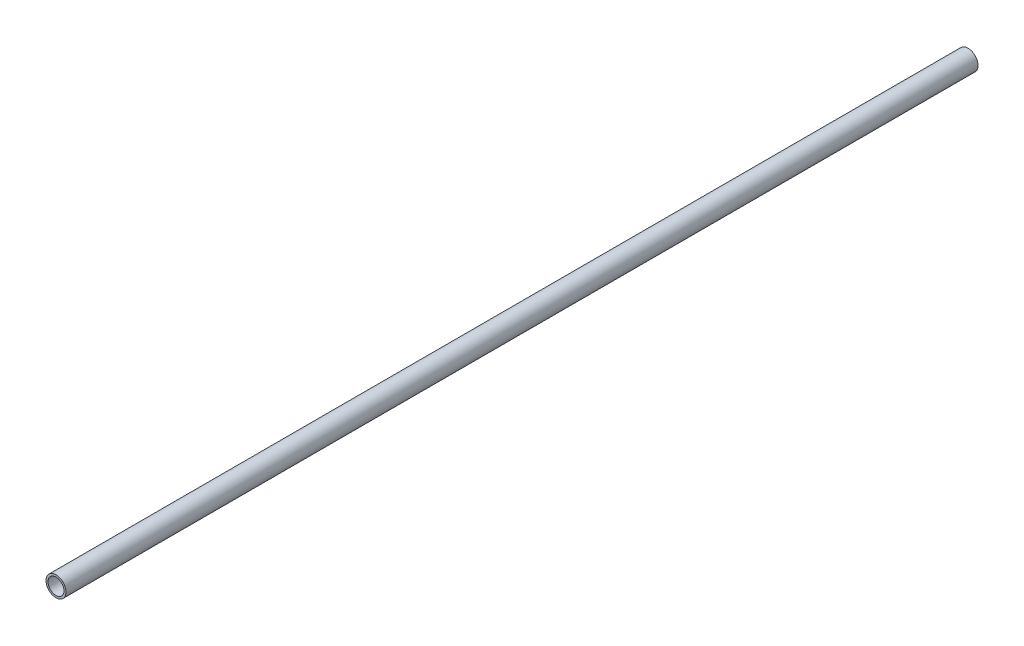
ISO-10303-21;
HEADER;
FILE_DESCRIPTION(('STEP AP214'),'2;1');
FILE_NAME('part.step','',(''),(''),'','','');
FILE_SCHEMA(('AUTOMOTIVE_DESIGN { 1 0 10303 214 1 1 1 1 }'));
ENDSEC;
DATA;
#1=APPLICATION_CONTEXT('core data for automotive mechanical design processes');
#2=APPLICATION_PROTOCOL_DEFINITION('international standard','automotive_design',2000,#1);
#3=PRODUCT_CONTEXT('',#1,'mechanical');
#4=PRODUCT('Part','Part','',(#3));
#5=PRODUCT_RELATED_PRODUCT_CATEGORY('part','',(#4));
#6=PRODUCT_DEFINITION_FORMATION('','',#4);
#7=PRODUCT_DEFINITION_CONTEXT('part definition',#1,'design');
#8=PRODUCT_DEFINITION('design','',#6,#7);
#9=PRODUCT_DEFINITION_SHAPE('','',#8);
#10=(LENGTH_UNIT() NAMED_UNIT(*) SI_UNIT(.MILLI.,.METRE.));
#11=(NAMED_UNIT(*) PLANE_ANGLE_UNIT() SI_UNIT($,.RADIAN.));
#12=(NAMED_UNIT(*) SI_UNIT($,.STERADIAN.) SOLID_ANGLE_UNIT());
#13=UNCERTAINTY_MEASURE_WITH_UNIT(LENGTH_MEASURE(1.E-05),#10,'distance_accuracy_value','');
#14=(GEOMETRIC_REPRESENTATION_CONTEXT(3) GLOBAL_UNCERTAINTY_ASSIGNED_CONTEXT((#13)) GLOBAL_UNIT_ASSIGNED_CONTEXT((#10,
#11,#12)) REPRESENTATION_CONTEXT('',''));
#15=CARTESIAN_POINT('',(0.,0.,0.));
#16=DIRECTION('',(0.,0.,1.));
#17=DIRECTION('',(1.,0.,0.));
#18=AXIS2_PLACEMENT_3D('',#15,#16,#17);
#19=CARTESIAN_POINT('',(-157.8901772807,194.270649183333,869.696000000001));
#20=DIRECTION('',(0.,0.,1.));
#21=DIRECTION('',(1.,0.,0.));
#22=AXIS2_PLACEMENT_3D('',#19,#20,#21);
#23=PLANE('',#22);
#24=CARTESIAN_POINT('',(-157.8901772807,194.270649183333,869.696000000001));
#25=DIRECTION('',(0.,0.,1.));
#26=DIRECTION('',(1.,0.,0.));
#27=AXIS2_PLACEMENT_3D('',#24,#25,#26);
#28=CIRCLE('',#27,9.52500000000002);
#29=CARTESIAN_POINT('',(-148.3651772807,194.270649183333,869.696000000001));
#30=VERTEX_POINT('',#29);
#31=EDGE_CURVE('E10',#30,#30,#28,.T.);
#32=ORIENTED_EDGE('',*,*,#31,.T.);
#33=EDGE_LOOP('',(#32));
#34=FACE_BOUND('',#33,.T.);
#35=CARTESIAN_POINT('',(-157.8901772807,194.270649183333,869.696000000001));
#36=DIRECTION('',(0.,0.,1.));
#37=DIRECTION('',(1.,0.,0.));
#38=AXIS2_PLACEMENT_3D('',#35,#36,#37);
#39=CIRCLE('',#38,7.62);
#40=CARTESIAN_POINT('',(-150.2701772807,194.270649183333,869.696000000001));
#41=VERTEX_POINT('',#40);
#42=EDGE_CURVE('E59',#41,#41,#39,.T.);
#43=ORIENTED_EDGE('',*,*,#42,.F.);
#44=EDGE_LOOP('',(#43));
#45=FACE_BOUND('',#44,.T.);
#46=ADVANCED_FACE('F45',(#34,#45),#23,.T.);
#47=CARTESIAN_POINT('',(-157.8901772807,194.270649183333,0.));
#48=DIRECTION('',(0.,0.,1.));
#49=DIRECTION('',(1.,0.,0.));
#50=AXIS2_PLACEMENT_3D('',#47,#48,#49);
#51=PLANE('',#50);
#52=CARTESIAN_POINT('',(-157.8901772807,194.270649183333,0.));
#53=DIRECTION('',(0.,0.,1.));
#54=DIRECTION('',(1.,0.,0.));
#55=AXIS2_PLACEMENT_3D('',#52,#53,#54);
#56=CIRCLE('',#55,9.52500000000002);
#57=CARTESIAN_POINT('',(-148.3651772807,194.270649183333,0.));
#58=VERTEX_POINT('',#57);
#59=EDGE_CURVE('E49',#58,#58,#56,.T.);
#60=ORIENTED_EDGE('',*,*,#59,.F.);
#61=EDGE_LOOP('',(#60));
#62=FACE_BOUND('',#61,.T.);
#63=CARTESIAN_POINT('',(-157.8901772807,194.270649183333,0.));
#64=DIRECTION('',(0.,0.,1.));
#65=DIRECTION('',(1.,0.,0.));
#66=AXIS2_PLACEMENT_3D('',#63,#64,#65);
#67=CIRCLE('',#66,7.62);
#68=CARTESIAN_POINT('',(-150.2701772807,194.270649183333,0.));
#69=VERTEX_POINT('',#68);
#70=EDGE_CURVE('E61',#69,#69,#67,.T.);
#71=ORIENTED_EDGE('',*,*,#70,.T.);
#72=EDGE_LOOP('',(#71));
#73=FACE_BOUND('',#72,.T.);
#74=ADVANCED_FACE('F72',(#62,#73),#51,.F.);
#75=CARTESIAN_POINT('',(-157.8901772807,194.270649183333,869.696000000001));
#76=DIRECTION('',(0.,0.,-1.));
#77=DIRECTION('',(-1.,0.,0.));
#78=AXIS2_PLACEMENT_3D('',#75,#76,#77);
#79=CYLINDRICAL_SURFACE('',#78,9.52500000000002);
#80=ORIENTED_EDGE('',*,*,#31,.F.);
#81=EDGE_LOOP('',(#80));
#82=FACE_BOUND('',#81,.T.);
#83=ORIENTED_EDGE('',*,*,#59,.T.);
#84=EDGE_LOOP('',(#83));
#85=FACE_BOUND('',#84,.T.);
#86=ADVANCED_FACE('F47',(#82,#85),#79,.T.);
#87=CARTESIAN_POINT('',(-157.8901772807,194.270649183333,869.696000000001));
#88=DIRECTION('',(0.,0.,-1.));
#89=DIRECTION('',(-1.,0.,0.));
#90=AXIS2_PLACEMENT_3D('',#87,#88,#89);
#91=CYLINDRICAL_SURFACE('',#90,7.62);
#92=ORIENTED_EDGE('',*,*,#42,.T.);
#93=EDGE_LOOP('',(#92));
#94=FACE_BOUND('',#93,.T.);
#95=ORIENTED_EDGE('',*,*,#70,.F.);
#96=EDGE_LOOP('',(#95));
#97=FACE_BOUND('',#96,.T.);
#98=ADVANCED_FACE('F68',(#94,#97),#91,.F.);
#99=CLOSED_SHELL('',(#46,#74,#86,#98));
#100=MANIFOLD_SOLID_BREP('B2',#99);
#101=ADVANCED_BREP_SHAPE_REPRESENTATION('',(#18,#100),#14);
#102=SHAPE_DEFINITION_REPRESENTATION(#9,#101);
ENDSEC;
END-ISO-10303-21;
